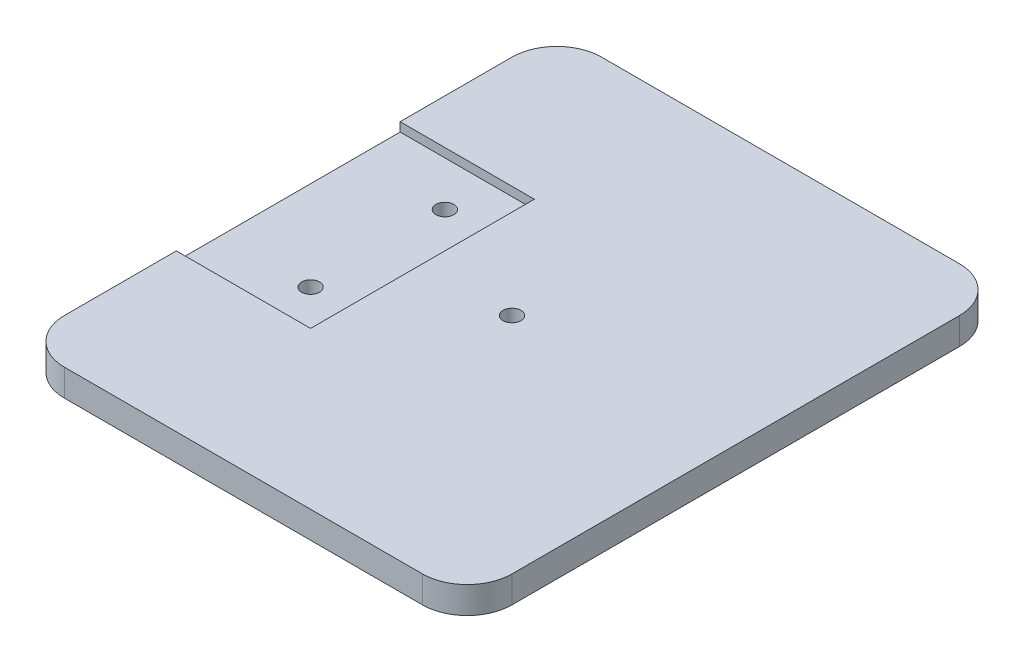
ISO-10303-21;
HEADER;
FILE_DESCRIPTION(('STEP AP214'),'2;1');
FILE_NAME('part.step','',(''),(''),'','','');
FILE_SCHEMA(('AUTOMOTIVE_DESIGN { 1 0 10303 214 1 1 1 1 }'));
ENDSEC;
DATA;
#1=APPLICATION_CONTEXT('core data for automotive mechanical design processes');
#2=APPLICATION_PROTOCOL_DEFINITION('international standard','automotive_design',2000,#1);
#3=PRODUCT_CONTEXT('',#1,'mechanical');
#4=PRODUCT('Part','Part','',(#3));
#5=PRODUCT_RELATED_PRODUCT_CATEGORY('part','',(#4));
#6=PRODUCT_DEFINITION_FORMATION('','',#4);
#7=PRODUCT_DEFINITION_CONTEXT('part definition',#1,'design');
#8=PRODUCT_DEFINITION('design','',#6,#7);
#9=PRODUCT_DEFINITION_SHAPE('','',#8);
#10=(LENGTH_UNIT() NAMED_UNIT(*) SI_UNIT(.MILLI.,.METRE.));
#11=(NAMED_UNIT(*) PLANE_ANGLE_UNIT() SI_UNIT($,.RADIAN.));
#12=(NAMED_UNIT(*) SI_UNIT($,.STERADIAN.) SOLID_ANGLE_UNIT());
#13=UNCERTAINTY_MEASURE_WITH_UNIT(LENGTH_MEASURE(1.E-05),#10,'distance_accuracy_value','');
#14=(GEOMETRIC_REPRESENTATION_CONTEXT(3) GLOBAL_UNCERTAINTY_ASSIGNED_CONTEXT((#13)) GLOBAL_UNIT_ASSIGNED_CONTEXT((#10,
#11,#12)) REPRESENTATION_CONTEXT('',''));
#15=CARTESIAN_POINT('',(0.,0.,0.));
#16=DIRECTION('',(0.,0.,1.));
#17=DIRECTION('',(1.,0.,0.));
#18=AXIS2_PLACEMENT_3D('',#15,#16,#17);
#19=CARTESIAN_POINT('',(-52.2549019607844,3.,28.7254901960784));
#20=DIRECTION('',(0.,1.,0.));
#21=DIRECTION('',(0.,0.,1.));
#22=AXIS2_PLACEMENT_3D('',#19,#20,#21);
#23=PLANE('',#22);
#24=DIRECTION('',(1.,0.,0.));
#25=VECTOR('',#24,1.);
#26=CARTESIAN_POINT('',(-57.2549019607844,3.,16.2254901960784));
#27=LINE('',#26,#25);
#28=CARTESIAN_POINT('',(-57.2549019607844,3.,16.2254901960784));
#29=VERTEX_POINT('',#28);
#30=CARTESIAN_POINT('',(-42.2549019607844,3.,16.2254901960784));
#31=VERTEX_POINT('',#30);
#32=EDGE_CURVE('E277',#29,#31,#27,.T.);
#33=ORIENTED_EDGE('',*,*,#32,.F.);
#34=DIRECTION('',(0.,0.,1.));
#35=VECTOR('',#34,1.);
#36=CARTESIAN_POINT('',(-57.2549019607844,3.,-21.2745098039215));
#37=LINE('',#36,#35);
#38=CARTESIAN_POINT('',(-57.2549019607844,3.,28.7254901960784));
#39=VERTEX_POINT('',#38);
#40=EDGE_CURVE('E68',#29,#39,#37,.T.);
#41=ORIENTED_EDGE('',*,*,#40,.T.);
#42=CARTESIAN_POINT('',(-52.2549019607844,3.,28.7254901960784));
#43=DIRECTION('',(0.,1.,0.));
#44=DIRECTION('',(0.,0.,1.));
#45=AXIS2_PLACEMENT_3D('',#42,#43,#44);
#46=CIRCLE('',#45,5.);
#47=CARTESIAN_POINT('',(-52.2549019607843,3.,33.7254901960784));
#48=VERTEX_POINT('',#47);
#49=EDGE_CURVE('E186',#39,#48,#46,.T.);
#50=ORIENTED_EDGE('',*,*,#49,.T.);
#51=DIRECTION('',(1.,0.,0.));
#52=VECTOR('',#51,1.);
#53=CARTESIAN_POINT('',(-52.2549019607843,3.,33.7254901960784));
#54=LINE('',#53,#52);
#55=CARTESIAN_POINT('',(-12.2549019607844,3.,33.7254901960784));
#56=VERTEX_POINT('',#55);
#57=EDGE_CURVE('E110',#48,#56,#54,.T.);
#58=ORIENTED_EDGE('',*,*,#57,.T.);
#59=CARTESIAN_POINT('',(-12.2549019607843,3.,28.7254901960784));
#60=DIRECTION('',(0.,1.,0.));
#61=DIRECTION('',(0.,0.,1.));
#62=AXIS2_PLACEMENT_3D('',#59,#60,#61);
#63=CIRCLE('',#62,5.);
#64=CARTESIAN_POINT('',(-7.25490196078435,3.,28.7254901960784));
#65=VERTEX_POINT('',#64);
#66=EDGE_CURVE('E208',#56,#65,#63,.T.);
#67=ORIENTED_EDGE('',*,*,#66,.T.);
#68=DIRECTION('',(0.,0.,-1.));
#69=VECTOR('',#68,1.);
#70=CARTESIAN_POINT('',(-7.25490196078435,3.,-21.2745098039215));
#71=LINE('',#70,#69);
#72=CARTESIAN_POINT('',(-7.25490196078435,3.,-21.2745098039215));
#73=VERTEX_POINT('',#72);
#74=EDGE_CURVE('E222',#65,#73,#71,.T.);
#75=ORIENTED_EDGE('',*,*,#74,.T.);
#76=CARTESIAN_POINT('',(-12.2549019607843,3.,-21.2745098039216));
#77=DIRECTION('',(0.,1.,0.));
#78=DIRECTION('',(0.,0.,-1.));
#79=AXIS2_PLACEMENT_3D('',#76,#77,#78);
#80=CIRCLE('',#79,5.);
#81=CARTESIAN_POINT('',(-12.2549019607844,3.,-26.2745098039216));
#82=VERTEX_POINT('',#81);
#83=EDGE_CURVE('E134',#73,#82,#80,.T.);
#84=ORIENTED_EDGE('',*,*,#83,.T.);
#85=DIRECTION('',(-1.,0.,0.));
#86=VECTOR('',#85,1.);
#87=CARTESIAN_POINT('',(-52.2549019607843,3.,-26.2745098039216));
#88=LINE('',#87,#86);
#89=CARTESIAN_POINT('',(-52.2549019607843,3.,-26.2745098039216));
#90=VERTEX_POINT('',#89);
#91=EDGE_CURVE('E126',#82,#90,#88,.T.);
#92=ORIENTED_EDGE('',*,*,#91,.T.);
#93=CARTESIAN_POINT('',(-52.2549019607844,3.,-21.2745098039216));
#94=DIRECTION('',(0.,1.,0.));
#95=DIRECTION('',(0.,0.,1.));
#96=AXIS2_PLACEMENT_3D('',#93,#94,#95);
#97=CIRCLE('',#96,5.);
#98=CARTESIAN_POINT('',(-57.2549019607844,3.,-21.2745098039215));
#99=VERTEX_POINT('',#98);
#100=EDGE_CURVE('E131',#90,#99,#97,.T.);
#101=ORIENTED_EDGE('',*,*,#100,.T.);
#102=CARTESIAN_POINT('',(-57.2549019607844,3.,-8.77450980392157));
#103=VERTEX_POINT('',#102);
#104=EDGE_CURVE('E156',#99,#103,#37,.T.);
#105=ORIENTED_EDGE('',*,*,#104,.T.);
#106=DIRECTION('',(1.,0.,0.));
#107=VECTOR('',#106,1.);
#108=CARTESIAN_POINT('',(-57.2549019607844,3.,-8.77450980392157));
#109=LINE('',#108,#107);
#110=CARTESIAN_POINT('',(-42.2549019607844,3.,-8.77450980392157));
#111=VERTEX_POINT('',#110);
#112=EDGE_CURVE('E268',#103,#111,#109,.T.);
#113=ORIENTED_EDGE('',*,*,#112,.T.);
#114=DIRECTION('',(0.,0.,1.));
#115=VECTOR('',#114,1.);
#116=CARTESIAN_POINT('',(-42.2549019607844,3.,-8.77450980392157));
#117=LINE('',#116,#115);
#118=EDGE_CURVE('E273',#111,#31,#117,.T.);
#119=ORIENTED_EDGE('',*,*,#118,.T.);
#120=EDGE_LOOP('',(#33,#41,#50,#58,#67,#75,#84,#92,#101,#105,#113,#119));
#121=FACE_BOUND('',#120,.T.);
#122=CARTESIAN_POINT('',(-32.2549019607844,3.,3.72549019607842));
#123=DIRECTION('',(0.,1.,0.));
#124=DIRECTION('',(0.,0.,1.));
#125=AXIS2_PLACEMENT_3D('',#122,#123,#124);
#126=CIRCLE('',#125,0.999999999999998);
#127=CARTESIAN_POINT('',(-32.2549019607844,3.,4.72549019607842));
#128=VERTEX_POINT('',#127);
#129=EDGE_CURVE('E167',#128,#128,#126,.T.);
#130=ORIENTED_EDGE('',*,*,#129,.F.);
#131=EDGE_LOOP('',(#130));
#132=FACE_BOUND('',#131,.T.);
#133=ADVANCED_FACE('F42',(#121,#132),#23,.T.);
#134=CARTESIAN_POINT('',(-52.2549019607844,0.,28.7254901960784));
#135=DIRECTION('',(0.,1.,0.));
#136=DIRECTION('',(0.,0.,1.));
#137=AXIS2_PLACEMENT_3D('',#134,#135,#136);
#138=PLANE('',#137);
#139=CARTESIAN_POINT('',(-52.2549019607844,0.,28.7254901960784));
#140=DIRECTION('',(0.,1.,0.));
#141=DIRECTION('',(0.,0.,1.));
#142=AXIS2_PLACEMENT_3D('',#139,#140,#141);
#143=CIRCLE('',#142,5.);
#144=CARTESIAN_POINT('',(-57.2549019607844,0.,28.7254901960784));
#145=VERTEX_POINT('',#144);
#146=CARTESIAN_POINT('',(-52.2549019607843,0.,33.7254901960784));
#147=VERTEX_POINT('',#146);
#148=EDGE_CURVE('E162',#145,#147,#143,.T.);
#149=ORIENTED_EDGE('',*,*,#148,.F.);
#150=DIRECTION('',(0.,0.,1.));
#151=VECTOR('',#150,1.);
#152=CARTESIAN_POINT('',(-57.2549019607844,0.,-21.2745098039215));
#153=LINE('',#152,#151);
#154=CARTESIAN_POINT('',(-57.2549019607844,0.,-21.2745098039215));
#155=VERTEX_POINT('',#154);
#156=EDGE_CURVE('E102',#155,#145,#153,.T.);
#157=ORIENTED_EDGE('',*,*,#156,.F.);
#158=CARTESIAN_POINT('',(-52.2549019607844,0.,-21.2745098039216));
#159=DIRECTION('',(0.,1.,0.));
#160=DIRECTION('',(0.,0.,1.));
#161=AXIS2_PLACEMENT_3D('',#158,#159,#160);
#162=CIRCLE('',#161,5.);
#163=CARTESIAN_POINT('',(-52.2549019607843,0.,-26.2745098039216));
#164=VERTEX_POINT('',#163);
#165=EDGE_CURVE('E181',#164,#155,#162,.T.);
#166=ORIENTED_EDGE('',*,*,#165,.F.);
#167=DIRECTION('',(-1.,0.,0.));
#168=VECTOR('',#167,1.);
#169=CARTESIAN_POINT('',(-52.2549019607843,0.,-26.2745098039216));
#170=LINE('',#169,#168);
#171=CARTESIAN_POINT('',(-12.2549019607844,0.,-26.2745098039216));
#172=VERTEX_POINT('',#171);
#173=EDGE_CURVE('E144',#172,#164,#170,.T.);
#174=ORIENTED_EDGE('',*,*,#173,.F.);
#175=CARTESIAN_POINT('',(-12.2549019607843,0.,-21.2745098039216));
#176=DIRECTION('',(0.,1.,0.));
#177=DIRECTION('',(0.,0.,-1.));
#178=AXIS2_PLACEMENT_3D('',#175,#176,#177);
#179=CIRCLE('',#178,5.);
#180=CARTESIAN_POINT('',(-7.25490196078435,0.,-21.2745098039215));
#181=VERTEX_POINT('',#180);
#182=EDGE_CURVE('E176',#181,#172,#179,.T.);
#183=ORIENTED_EDGE('',*,*,#182,.F.);
#184=DIRECTION('',(0.,0.,-1.));
#185=VECTOR('',#184,1.);
#186=CARTESIAN_POINT('',(-7.25490196078435,0.,-21.2745098039215));
#187=LINE('',#186,#185);
#188=CARTESIAN_POINT('',(-7.25490196078435,0.,28.7254901960784));
#189=VERTEX_POINT('',#188);
#190=EDGE_CURVE('E173',#189,#181,#187,.T.);
#191=ORIENTED_EDGE('',*,*,#190,.F.);
#192=CARTESIAN_POINT('',(-12.2549019607843,0.,28.7254901960784));
#193=DIRECTION('',(0.,1.,0.));
#194=DIRECTION('',(0.,0.,1.));
#195=AXIS2_PLACEMENT_3D('',#192,#193,#194);
#196=CIRCLE('',#195,5.);
#197=CARTESIAN_POINT('',(-12.2549019607844,0.,33.7254901960784));
#198=VERTEX_POINT('',#197);
#199=EDGE_CURVE('E170',#198,#189,#196,.T.);
#200=ORIENTED_EDGE('',*,*,#199,.F.);
#201=DIRECTION('',(1.,0.,0.));
#202=VECTOR('',#201,1.);
#203=CARTESIAN_POINT('',(-52.2549019607843,0.,33.7254901960784));
#204=LINE('',#203,#202);
#205=EDGE_CURVE('E166',#147,#198,#204,.T.);
#206=ORIENTED_EDGE('',*,*,#205,.F.);
#207=EDGE_LOOP('',(#149,#157,#166,#174,#183,#191,#200,#206));
#208=FACE_BOUND('',#207,.T.);
#209=CARTESIAN_POINT('',(-32.2549019607844,0.,3.72549019607842));
#210=DIRECTION('',(0.,1.,0.));
#211=DIRECTION('',(0.,0.,1.));
#212=AXIS2_PLACEMENT_3D('',#209,#210,#211);
#213=CIRCLE('',#212,0.999999999999998);
#214=CARTESIAN_POINT('',(-32.2549019607844,0.,4.72549019607842));
#215=VERTEX_POINT('',#214);
#216=EDGE_CURVE('E232',#215,#215,#213,.T.);
#217=ORIENTED_EDGE('',*,*,#216,.T.);
#218=EDGE_LOOP('',(#217));
#219=FACE_BOUND('',#218,.T.);
#220=CARTESIAN_POINT('',(-47.2549019607844,0.,-3.77450980392158));
#221=DIRECTION('',(0.,1.,0.));
#222=DIRECTION('',(0.,0.,1.));
#223=AXIS2_PLACEMENT_3D('',#220,#221,#222);
#224=CIRCLE('',#223,0.999999999999998);
#225=CARTESIAN_POINT('',(-47.2549019607844,0.,-2.77450980392158));
#226=VERTEX_POINT('',#225);
#227=EDGE_CURVE('E236',#226,#226,#224,.T.);
#228=ORIENTED_EDGE('',*,*,#227,.T.);
#229=EDGE_LOOP('',(#228));
#230=FACE_BOUND('',#229,.T.);
#231=CARTESIAN_POINT('',(-47.2549019607844,0.,11.2254901960784));
#232=DIRECTION('',(0.,1.,0.));
#233=DIRECTION('',(0.,0.,1.));
#234=AXIS2_PLACEMENT_3D('',#231,#232,#233);
#235=CIRCLE('',#234,0.999999999999998);
#236=CARTESIAN_POINT('',(-47.2549019607844,0.,12.2254901960784));
#237=VERTEX_POINT('',#236);
#238=EDGE_CURVE('E243',#237,#237,#235,.T.);
#239=ORIENTED_EDGE('',*,*,#238,.T.);
#240=EDGE_LOOP('',(#239));
#241=FACE_BOUND('',#240,.T.);
#242=ADVANCED_FACE('F212',(#208,#219,#230,#241),#138,.F.);
#243=CARTESIAN_POINT('',(-52.2549019607844,3.,28.7254901960784));
#244=DIRECTION('',(0.,-1.,0.));
#245=DIRECTION('',(0.,0.,-1.));
#246=AXIS2_PLACEMENT_3D('',#243,#244,#245);
#247=CYLINDRICAL_SURFACE('',#246,5.);
#248=ORIENTED_EDGE('',*,*,#148,.T.);
#249=DIRECTION('',(0.,-1.,0.));
#250=VECTOR('',#249,1.);
#251=CARTESIAN_POINT('',(-52.2549019607843,3.,33.7254901960784));
#252=LINE('',#251,#250);
#253=EDGE_CURVE('E11',#48,#147,#252,.T.);
#254=ORIENTED_EDGE('',*,*,#253,.F.);
#255=ORIENTED_EDGE('',*,*,#49,.F.);
#256=DIRECTION('',(0.,-1.,0.));
#257=VECTOR('',#256,1.);
#258=CARTESIAN_POINT('',(-57.2549019607844,3.,28.7254901960784));
#259=LINE('',#258,#257);
#260=EDGE_CURVE('E161',#39,#145,#259,.T.);
#261=ORIENTED_EDGE('',*,*,#260,.T.);
#262=EDGE_LOOP('',(#248,#254,#255,#261));
#263=FACE_BOUND('',#262,.T.);
#264=ADVANCED_FACE('F44',(#263),#247,.T.);
#265=CARTESIAN_POINT('',(-52.2549019607843,3.,33.7254901960784));
#266=DIRECTION('',(0.,0.,-1.));
#267=DIRECTION('',(-1.,0.,0.));
#268=AXIS2_PLACEMENT_3D('',#265,#266,#267);
#269=PLANE('',#268);
#270=ORIENTED_EDGE('',*,*,#205,.T.);
#271=DIRECTION('',(0.,-1.,0.));
#272=VECTOR('',#271,1.);
#273=CARTESIAN_POINT('',(-12.2549019607844,3.,33.7254901960784));
#274=LINE('',#273,#272);
#275=EDGE_CURVE('E52',#56,#198,#274,.T.);
#276=ORIENTED_EDGE('',*,*,#275,.F.);
#277=ORIENTED_EDGE('',*,*,#57,.F.);
#278=ORIENTED_EDGE('',*,*,#253,.T.);
#279=EDGE_LOOP('',(#270,#276,#277,#278));
#280=FACE_BOUND('',#279,.T.);
#281=ADVANCED_FACE('F317',(#280),#269,.F.);
#282=CARTESIAN_POINT('',(-12.2549019607843,3.,28.7254901960784));
#283=DIRECTION('',(0.,-1.,0.));
#284=DIRECTION('',(0.,0.,-1.));
#285=AXIS2_PLACEMENT_3D('',#282,#283,#284);
#286=CYLINDRICAL_SURFACE('',#285,5.);
#287=ORIENTED_EDGE('',*,*,#199,.T.);
#288=DIRECTION('',(0.,-1.,0.));
#289=VECTOR('',#288,1.);
#290=CARTESIAN_POINT('',(-7.25490196078435,3.,28.7254901960784));
#291=LINE('',#290,#289);
#292=EDGE_CURVE('E197',#65,#189,#291,.T.);
#293=ORIENTED_EDGE('',*,*,#292,.F.);
#294=ORIENTED_EDGE('',*,*,#66,.F.);
#295=ORIENTED_EDGE('',*,*,#275,.T.);
#296=EDGE_LOOP('',(#287,#293,#294,#295));
#297=FACE_BOUND('',#296,.T.);
#298=ADVANCED_FACE('F206',(#297),#286,.T.);
#299=CARTESIAN_POINT('',(-7.25490196078435,3.,-21.2745098039215));
#300=DIRECTION('',(-1.,0.,0.));
#301=DIRECTION('',(0.,0.,1.));
#302=AXIS2_PLACEMENT_3D('',#299,#300,#301);
#303=PLANE('',#302);
#304=ORIENTED_EDGE('',*,*,#190,.T.);
#305=DIRECTION('',(0.,-1.,0.));
#306=VECTOR('',#305,1.);
#307=CARTESIAN_POINT('',(-7.25490196078435,3.,-21.2745098039215));
#308=LINE('',#307,#306);
#309=EDGE_CURVE('E193',#73,#181,#308,.T.);
#310=ORIENTED_EDGE('',*,*,#309,.F.);
#311=ORIENTED_EDGE('',*,*,#74,.F.);
#312=ORIENTED_EDGE('',*,*,#292,.T.);
#313=EDGE_LOOP('',(#304,#310,#311,#312));
#314=FACE_BOUND('',#313,.T.);
#315=ADVANCED_FACE('F217',(#314),#303,.F.);
#316=CARTESIAN_POINT('',(-12.2549019607843,3.,-21.2745098039216));
#317=DIRECTION('',(0.,-1.,0.));
#318=DIRECTION('',(0.,0.,-1.));
#319=AXIS2_PLACEMENT_3D('',#316,#317,#318);
#320=CYLINDRICAL_SURFACE('',#319,5.);
#321=ORIENTED_EDGE('',*,*,#182,.T.);
#322=DIRECTION('',(0.,-1.,0.));
#323=VECTOR('',#322,1.);
#324=CARTESIAN_POINT('',(-12.2549019607844,3.,-26.2745098039216));
#325=LINE('',#324,#323);
#326=EDGE_CURVE('E148',#82,#172,#325,.T.);
#327=ORIENTED_EDGE('',*,*,#326,.F.);
#328=ORIENTED_EDGE('',*,*,#83,.F.);
#329=ORIENTED_EDGE('',*,*,#309,.T.);
#330=EDGE_LOOP('',(#321,#327,#328,#329));
#331=FACE_BOUND('',#330,.T.);
#332=ADVANCED_FACE('F220',(#331),#320,.T.);
#333=CARTESIAN_POINT('',(-52.2549019607843,3.,-26.2745098039216));
#334=DIRECTION('',(0.,0.,1.));
#335=DIRECTION('',(1.,0.,0.));
#336=AXIS2_PLACEMENT_3D('',#333,#334,#335);
#337=PLANE('',#336);
#338=ORIENTED_EDGE('',*,*,#173,.T.);
#339=DIRECTION('',(0.,-1.,0.));
#340=VECTOR('',#339,1.);
#341=CARTESIAN_POINT('',(-52.2549019607843,3.,-26.2745098039216));
#342=LINE('',#341,#340);
#343=EDGE_CURVE('E141',#90,#164,#342,.T.);
#344=ORIENTED_EDGE('',*,*,#343,.F.);
#345=ORIENTED_EDGE('',*,*,#91,.F.);
#346=ORIENTED_EDGE('',*,*,#326,.T.);
#347=EDGE_LOOP('',(#338,#344,#345,#346));
#348=FACE_BOUND('',#347,.T.);
#349=ADVANCED_FACE('F142',(#348),#337,.F.);
#350=CARTESIAN_POINT('',(-52.2549019607844,3.,-21.2745098039216));
#351=DIRECTION('',(0.,-1.,0.));
#352=DIRECTION('',(0.,0.,-1.));
#353=AXIS2_PLACEMENT_3D('',#350,#351,#352);
#354=CYLINDRICAL_SURFACE('',#353,5.);
#355=ORIENTED_EDGE('',*,*,#165,.T.);
#356=DIRECTION('',(0.,-1.,0.));
#357=VECTOR('',#356,1.);
#358=CARTESIAN_POINT('',(-57.2549019607844,3.,-21.2745098039215));
#359=LINE('',#358,#357);
#360=EDGE_CURVE('E149',#99,#155,#359,.T.);
#361=ORIENTED_EDGE('',*,*,#360,.F.);
#362=ORIENTED_EDGE('',*,*,#100,.F.);
#363=ORIENTED_EDGE('',*,*,#343,.T.);
#364=EDGE_LOOP('',(#355,#361,#362,#363));
#365=FACE_BOUND('',#364,.T.);
#366=ADVANCED_FACE('F151',(#365),#354,.T.);
#367=CARTESIAN_POINT('',(-57.2549019607844,3.,-21.2745098039215));
#368=DIRECTION('',(1.,0.,0.));
#369=DIRECTION('',(0.,0.,-1.));
#370=AXIS2_PLACEMENT_3D('',#367,#368,#369);
#371=PLANE('',#370);
#372=ORIENTED_EDGE('',*,*,#40,.F.);
#373=DIRECTION('',(0.,1.,0.));
#374=VECTOR('',#373,1.);
#375=CARTESIAN_POINT('',(-57.2549019607844,2.,16.2254901960784));
#376=LINE('',#375,#374);
#377=CARTESIAN_POINT('',(-57.2549019607844,2.,16.2254901960784));
#378=VERTEX_POINT('',#377);
#379=EDGE_CURVE('E264',#378,#29,#376,.T.);
#380=ORIENTED_EDGE('',*,*,#379,.F.);
#381=DIRECTION('',(0.,0.,1.));
#382=VECTOR('',#381,1.);
#383=CARTESIAN_POINT('',(-57.2549019607844,2.,-8.77450980392157));
#384=LINE('',#383,#382);
#385=CARTESIAN_POINT('',(-57.2549019607844,2.,-8.77450980392157));
#386=VERTEX_POINT('',#385);
#387=EDGE_CURVE('E256',#386,#378,#384,.T.);
#388=ORIENTED_EDGE('',*,*,#387,.F.);
#389=DIRECTION('',(0.,1.,0.));
#390=VECTOR('',#389,1.);
#391=CARTESIAN_POINT('',(-57.2549019607844,2.,-8.77450980392157));
#392=LINE('',#391,#390);
#393=EDGE_CURVE('E260',#386,#103,#392,.T.);
#394=ORIENTED_EDGE('',*,*,#393,.T.);
#395=ORIENTED_EDGE('',*,*,#104,.F.);
#396=ORIENTED_EDGE('',*,*,#360,.T.);
#397=ORIENTED_EDGE('',*,*,#156,.T.);
#398=ORIENTED_EDGE('',*,*,#260,.F.);
#399=EDGE_LOOP('',(#372,#380,#388,#394,#395,#396,#397,#398));
#400=FACE_BOUND('',#399,.T.);
#401=ADVANCED_FACE('F313',(#400),#371,.F.);
#402=CARTESIAN_POINT('',(-32.2549019607844,3.,3.72549019607842));
#403=DIRECTION('',(0.,-1.,0.));
#404=DIRECTION('',(0.,0.,-1.));
#405=AXIS2_PLACEMENT_3D('',#402,#403,#404);
#406=CYLINDRICAL_SURFACE('',#405,0.999999999999998);
#407=ORIENTED_EDGE('',*,*,#129,.T.);
#408=EDGE_LOOP('',(#407));
#409=FACE_BOUND('',#408,.T.);
#410=ORIENTED_EDGE('',*,*,#216,.F.);
#411=EDGE_LOOP('',(#410));
#412=FACE_BOUND('',#411,.T.);
#413=ADVANCED_FACE('F333',(#409,#412),#406,.F.);
#414=CARTESIAN_POINT('',(-47.2549019607844,3.,-3.77450980392158));
#415=DIRECTION('',(0.,-1.,0.));
#416=DIRECTION('',(0.,0.,-1.));
#417=AXIS2_PLACEMENT_3D('',#414,#415,#416);
#418=CYLINDRICAL_SURFACE('',#417,0.999999999999998);
#419=CARTESIAN_POINT('',(-47.2549019607844,2.,-3.77450980392158));
#420=DIRECTION('',(0.,-1.,0.));
#421=DIRECTION('',(0.,0.,-1.));
#422=AXIS2_PLACEMENT_3D('',#419,#420,#421);
#423=CIRCLE('',#422,0.999999999999998);
#424=CARTESIAN_POINT('',(-47.2549019607844,2.,-4.77450980392158));
#425=VERTEX_POINT('',#424);
#426=EDGE_CURVE('E247',#425,#425,#423,.T.);
#427=ORIENTED_EDGE('',*,*,#426,.F.);
#428=EDGE_LOOP('',(#427));
#429=FACE_BOUND('',#428,.T.);
#430=ORIENTED_EDGE('',*,*,#227,.F.);
#431=EDGE_LOOP('',(#430));
#432=FACE_BOUND('',#431,.T.);
#433=ADVANCED_FACE('F374',(#429,#432),#418,.F.);
#434=CARTESIAN_POINT('',(-47.2549019607844,3.,11.2254901960784));
#435=DIRECTION('',(0.,-1.,0.));
#436=DIRECTION('',(0.,0.,-1.));
#437=AXIS2_PLACEMENT_3D('',#434,#435,#436);
#438=CYLINDRICAL_SURFACE('',#437,0.999999999999998);
#439=CARTESIAN_POINT('',(-47.2549019607844,2.,11.2254901960784));
#440=DIRECTION('',(0.,-1.,0.));
#441=DIRECTION('',(0.,0.,-1.));
#442=AXIS2_PLACEMENT_3D('',#439,#440,#441);
#443=CIRCLE('',#442,0.999999999999998);
#444=CARTESIAN_POINT('',(-47.2549019607844,2.,10.2254901960784));
#445=VERTEX_POINT('',#444);
#446=EDGE_CURVE('E46',#445,#445,#443,.T.);
#447=ORIENTED_EDGE('',*,*,#446,.F.);
#448=EDGE_LOOP('',(#447));
#449=FACE_BOUND('',#448,.T.);
#450=ORIENTED_EDGE('',*,*,#238,.F.);
#451=EDGE_LOOP('',(#450));
#452=FACE_BOUND('',#451,.T.);
#453=ADVANCED_FACE('F380',(#449,#452),#438,.F.);
#454=CARTESIAN_POINT('',(-57.2549019607844,2.,16.2254901960784));
#455=DIRECTION('',(0.,0.,1.));
#456=DIRECTION('',(1.,0.,0.));
#457=AXIS2_PLACEMENT_3D('',#454,#455,#456);
#458=PLANE('',#457);
#459=ORIENTED_EDGE('',*,*,#32,.T.);
#460=DIRECTION('',(0.,1.,0.));
#461=VECTOR('',#460,1.);
#462=CARTESIAN_POINT('',(-42.2549019607844,2.,16.2254901960784));
#463=LINE('',#462,#461);
#464=CARTESIAN_POINT('',(-42.2549019607844,2.,16.2254901960784));
#465=VERTEX_POINT('',#464);
#466=EDGE_CURVE('E251',#465,#31,#463,.T.);
#467=ORIENTED_EDGE('',*,*,#466,.F.);
#468=DIRECTION('',(1.,0.,0.));
#469=VECTOR('',#468,1.);
#470=CARTESIAN_POINT('',(-57.2549019607844,2.,16.2254901960784));
#471=LINE('',#470,#469);
#472=EDGE_CURVE('E272',#378,#465,#471,.T.);
#473=ORIENTED_EDGE('',*,*,#472,.F.);
#474=ORIENTED_EDGE('',*,*,#379,.T.);
#475=EDGE_LOOP('',(#459,#467,#473,#474));
#476=FACE_BOUND('',#475,.T.);
#477=ADVANCED_FACE('F300',(#476),#458,.F.);
#478=CARTESIAN_POINT('',(-57.2549019607844,2.,-8.77450980392157));
#479=DIRECTION('',(0.,0.,1.));
#480=DIRECTION('',(1.,0.,0.));
#481=AXIS2_PLACEMENT_3D('',#478,#479,#480);
#482=PLANE('',#481);
#483=ORIENTED_EDGE('',*,*,#112,.F.);
#484=ORIENTED_EDGE('',*,*,#393,.F.);
#485=DIRECTION('',(1.,0.,0.));
#486=VECTOR('',#485,1.);
#487=CARTESIAN_POINT('',(-57.2549019607844,2.,-8.77450980392157));
#488=LINE('',#487,#486);
#489=CARTESIAN_POINT('',(-42.2549019607844,2.,-8.77450980392157));
#490=VERTEX_POINT('',#489);
#491=EDGE_CURVE('E59',#386,#490,#488,.T.);
#492=ORIENTED_EDGE('',*,*,#491,.T.);
#493=DIRECTION('',(0.,1.,0.));
#494=VECTOR('',#493,1.);
#495=CARTESIAN_POINT('',(-42.2549019607844,2.,-8.77450980392157));
#496=LINE('',#495,#494);
#497=EDGE_CURVE('E255',#490,#111,#496,.T.);
#498=ORIENTED_EDGE('',*,*,#497,.T.);
#499=EDGE_LOOP('',(#483,#484,#492,#498));
#500=FACE_BOUND('',#499,.T.);
#501=ADVANCED_FACE('F310',(#500),#482,.T.);
#502=CARTESIAN_POINT('',(-42.2549019607844,2.,-8.77450980392157));
#503=DIRECTION('',(-1.,0.,0.));
#504=DIRECTION('',(0.,0.,1.));
#505=AXIS2_PLACEMENT_3D('',#502,#503,#504);
#506=PLANE('',#505);
#507=ORIENTED_EDGE('',*,*,#118,.F.);
#508=ORIENTED_EDGE('',*,*,#497,.F.);
#509=DIRECTION('',(0.,0.,1.));
#510=VECTOR('',#509,1.);
#511=CARTESIAN_POINT('',(-42.2549019607844,2.,-8.77450980392157));
#512=LINE('',#511,#510);
#513=EDGE_CURVE('E285',#490,#465,#512,.T.);
#514=ORIENTED_EDGE('',*,*,#513,.T.);
#515=ORIENTED_EDGE('',*,*,#466,.T.);
#516=EDGE_LOOP('',(#507,#508,#514,#515));
#517=FACE_BOUND('',#516,.T.);
#518=ADVANCED_FACE('F405',(#517),#506,.T.);
#519=CARTESIAN_POINT('',(0.,2.,0.));
#520=DIRECTION('',(0.,-1.,0.));
#521=DIRECTION('',(0.,0.,-1.));
#522=AXIS2_PLACEMENT_3D('',#519,#520,#521);
#523=PLANE('',#522);
#524=ORIENTED_EDGE('',*,*,#426,.T.);
#525=EDGE_LOOP('',(#524));
#526=FACE_BOUND('',#525,.T.);
#527=ORIENTED_EDGE('',*,*,#446,.T.);
#528=EDGE_LOOP('',(#527));
#529=FACE_BOUND('',#528,.T.);
#530=ORIENTED_EDGE('',*,*,#472,.T.);
#531=ORIENTED_EDGE('',*,*,#513,.F.);
#532=ORIENTED_EDGE('',*,*,#491,.F.);
#533=ORIENTED_EDGE('',*,*,#387,.T.);
#534=EDGE_LOOP('',(#530,#531,#532,#533));
#535=FACE_BOUND('',#534,.T.);
#536=ADVANCED_FACE('F293',(#526,#529,#535),#523,.F.);
#537=CLOSED_SHELL('',(#133,#242,#264,#281,#298,#315,#332,#349,#366,#401,#413,#433,#453,#477,
#501,#518,#536));
#538=MANIFOLD_SOLID_BREP('B2',#537);
#539=ADVANCED_BREP_SHAPE_REPRESENTATION('',(#18,#538),#14);
#540=SHAPE_DEFINITION_REPRESENTATION(#9,#539);
ENDSEC;
END-ISO-10303-21;
